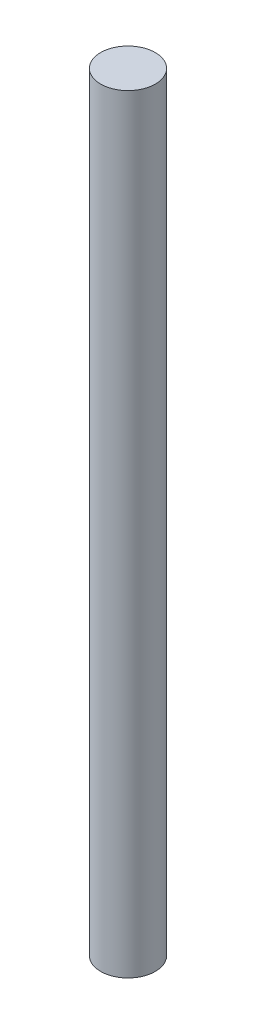
ISO-10303-21;
HEADER;
FILE_DESCRIPTION(('STEP AP214'),'2;1');
FILE_NAME('part.step','',(''),(''),'','','');
FILE_SCHEMA(('AUTOMOTIVE_DESIGN { 1 0 10303 214 1 1 1 1 }'));
ENDSEC;
DATA;
#1=APPLICATION_CONTEXT('core data for automotive mechanical design processes');
#2=APPLICATION_PROTOCOL_DEFINITION('international standard','automotive_design',2000,#1);
#3=PRODUCT_CONTEXT('',#1,'mechanical');
#4=PRODUCT('Part','Part','',(#3));
#5=PRODUCT_RELATED_PRODUCT_CATEGORY('part','',(#4));
#6=PRODUCT_DEFINITION_FORMATION('','',#4);
#7=PRODUCT_DEFINITION_CONTEXT('part definition',#1,'design');
#8=PRODUCT_DEFINITION('design','',#6,#7);
#9=PRODUCT_DEFINITION_SHAPE('','',#8);
#10=(LENGTH_UNIT() NAMED_UNIT(*) SI_UNIT(.MILLI.,.METRE.));
#11=(NAMED_UNIT(*) PLANE_ANGLE_UNIT() SI_UNIT($,.RADIAN.));
#12=(NAMED_UNIT(*) SI_UNIT($,.STERADIAN.) SOLID_ANGLE_UNIT());
#13=UNCERTAINTY_MEASURE_WITH_UNIT(LENGTH_MEASURE(1.E-05),#10,'distance_accuracy_value','');
#14=(GEOMETRIC_REPRESENTATION_CONTEXT(3) GLOBAL_UNCERTAINTY_ASSIGNED_CONTEXT((#13)) GLOBAL_UNIT_ASSIGNED_CONTEXT((#10,
#11,#12)) REPRESENTATION_CONTEXT('',''));
#15=CARTESIAN_POINT('',(0.,0.,0.));
#16=DIRECTION('',(0.,0.,1.));
#17=DIRECTION('',(1.,0.,0.));
#18=AXIS2_PLACEMENT_3D('',#15,#16,#17);
#19=CARTESIAN_POINT('',(0.,112.5,0.));
#20=DIRECTION('',(0.,-1.,0.));
#21=DIRECTION('',(0.,0.,-1.));
#22=AXIS2_PLACEMENT_3D('',#19,#20,#21);
#23=CYLINDRICAL_SURFACE('',#22,4.);
#24=CARTESIAN_POINT('',(0.,112.5,0.));
#25=DIRECTION('',(0.,1.,0.));
#26=DIRECTION('',(0.,0.,1.));
#27=AXIS2_PLACEMENT_3D('',#24,#25,#26);
#28=CIRCLE('',#27,4.);
#29=CARTESIAN_POINT('',(0.,112.5,4.));
#30=VERTEX_POINT('',#29);
#31=EDGE_CURVE('E10',#30,#30,#28,.T.);
#32=ORIENTED_EDGE('',*,*,#31,.F.);
#33=EDGE_LOOP('',(#32));
#34=FACE_BOUND('',#33,.T.);
#35=CARTESIAN_POINT('',(0.,0.,0.));
#36=DIRECTION('',(0.,1.,0.));
#37=DIRECTION('',(0.,0.,1.));
#38=AXIS2_PLACEMENT_3D('',#35,#36,#37);
#39=CIRCLE('',#38,4.);
#40=CARTESIAN_POINT('',(0.,0.,4.));
#41=VERTEX_POINT('',#40);
#42=EDGE_CURVE('E40',#41,#41,#39,.T.);
#43=ORIENTED_EDGE('',*,*,#42,.T.);
#44=EDGE_LOOP('',(#43));
#45=FACE_BOUND('',#44,.T.);
#46=ADVANCED_FACE('F37',(#34,#45),#23,.T.);
#47=CARTESIAN_POINT('',(0.,112.5,0.));
#48=DIRECTION('',(0.,1.,0.));
#49=DIRECTION('',(0.,0.,1.));
#50=AXIS2_PLACEMENT_3D('',#47,#48,#49);
#51=PLANE('',#50);
#52=ORIENTED_EDGE('',*,*,#31,.T.);
#53=EDGE_LOOP('',(#52));
#54=FACE_BOUND('',#53,.T.);
#55=ADVANCED_FACE('F54',(#54),#51,.T.);
#56=CARTESIAN_POINT('',(0.,0.,0.));
#57=DIRECTION('',(0.,1.,0.));
#58=DIRECTION('',(0.,0.,1.));
#59=AXIS2_PLACEMENT_3D('',#56,#57,#58);
#60=PLANE('',#59);
#61=ORIENTED_EDGE('',*,*,#42,.F.);
#62=EDGE_LOOP('',(#61));
#63=FACE_BOUND('',#62,.T.);
#64=ADVANCED_FACE('F52',(#63),#60,.F.);
#65=CLOSED_SHELL('',(#46,#55,#64));
#66=MANIFOLD_SOLID_BREP('B2',#65);
#67=ADVANCED_BREP_SHAPE_REPRESENTATION('',(#18,#66),#14);
#68=SHAPE_DEFINITION_REPRESENTATION(#9,#67);
ENDSEC;
END-ISO-10303-21;
